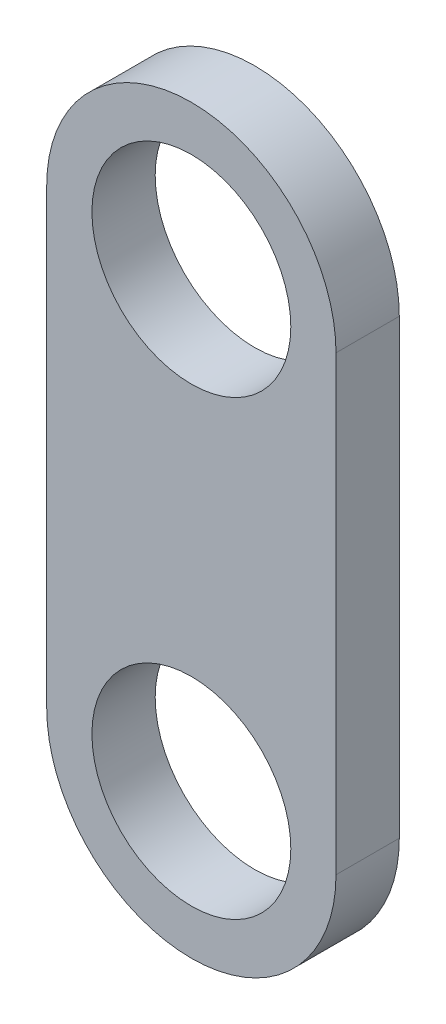
ISO-10303-21;
HEADER;
FILE_DESCRIPTION(('STEP AP214'),'2;1');
FILE_NAME('part.step','',(''),(''),'','','');
FILE_SCHEMA(('AUTOMOTIVE_DESIGN { 1 0 10303 214 1 1 1 1 }'));
ENDSEC;
DATA;
#1=APPLICATION_CONTEXT('core data for automotive mechanical design processes');
#2=APPLICATION_PROTOCOL_DEFINITION('international standard','automotive_design',2000,#1);
#3=PRODUCT_CONTEXT('',#1,'mechanical');
#4=PRODUCT('Part','Part','',(#3));
#5=PRODUCT_RELATED_PRODUCT_CATEGORY('part','',(#4));
#6=PRODUCT_DEFINITION_FORMATION('','',#4);
#7=PRODUCT_DEFINITION_CONTEXT('part definition',#1,'design');
#8=PRODUCT_DEFINITION('design','',#6,#7);
#9=PRODUCT_DEFINITION_SHAPE('','',#8);
#10=(LENGTH_UNIT() NAMED_UNIT(*) SI_UNIT(.MILLI.,.METRE.));
#11=(NAMED_UNIT(*) PLANE_ANGLE_UNIT() SI_UNIT($,.RADIAN.));
#12=(NAMED_UNIT(*) SI_UNIT($,.STERADIAN.) SOLID_ANGLE_UNIT());
#13=UNCERTAINTY_MEASURE_WITH_UNIT(LENGTH_MEASURE(1.E-05),#10,'distance_accuracy_value','');
#14=(GEOMETRIC_REPRESENTATION_CONTEXT(3) GLOBAL_UNCERTAINTY_ASSIGNED_CONTEXT((#13)) GLOBAL_UNIT_ASSIGNED_CONTEXT((#10,
#11,#12)) REPRESENTATION_CONTEXT('',''));
#15=CARTESIAN_POINT('',(0.,0.,0.));
#16=DIRECTION('',(0.,0.,1.));
#17=DIRECTION('',(1.,0.,0.));
#18=AXIS2_PLACEMENT_3D('',#15,#16,#17);
#19=CARTESIAN_POINT('',(0.,-25.,7.));
#20=DIRECTION('',(0.,0.,-1.));
#21=DIRECTION('',(-1.,0.,0.));
#22=AXIS2_PLACEMENT_3D('',#19,#20,#21);
#23=CYLINDRICAL_SURFACE('',#22,16.);
#24=CARTESIAN_POINT('',(0.,-25.,0.));
#25=DIRECTION('',(0.,0.,1.));
#26=DIRECTION('',(1.,0.,0.));
#27=AXIS2_PLACEMENT_3D('',#24,#25,#26);
#28=CIRCLE('',#27,16.);
#29=CARTESIAN_POINT('',(-16.,-25.,0.));
#30=VERTEX_POINT('',#29);
#31=CARTESIAN_POINT('',(16.,-25.,0.));
#32=VERTEX_POINT('',#31);
#33=EDGE_CURVE('E122',#30,#32,#28,.T.);
#34=ORIENTED_EDGE('',*,*,#33,.T.);
#35=DIRECTION('',(0.,0.,-1.));
#36=VECTOR('',#35,1.);
#37=CARTESIAN_POINT('',(16.,-25.,7.));
#38=LINE('',#37,#36);
#39=CARTESIAN_POINT('',(16.,-25.,7.));
#40=VERTEX_POINT('',#39);
#41=EDGE_CURVE('E11',#40,#32,#38,.T.);
#42=ORIENTED_EDGE('',*,*,#41,.F.);
#43=CARTESIAN_POINT('',(0.,-25.,7.));
#44=DIRECTION('',(0.,0.,1.));
#45=DIRECTION('',(1.,0.,0.));
#46=AXIS2_PLACEMENT_3D('',#43,#44,#45);
#47=CIRCLE('',#46,16.);
#48=CARTESIAN_POINT('',(-16.,-25.,7.));
#49=VERTEX_POINT('',#48);
#50=EDGE_CURVE('E98',#49,#40,#47,.T.);
#51=ORIENTED_EDGE('',*,*,#50,.F.);
#52=DIRECTION('',(0.,0.,-1.));
#53=VECTOR('',#52,1.);
#54=CARTESIAN_POINT('',(-16.,-25.,7.));
#55=LINE('',#54,#53);
#56=EDGE_CURVE('E121',#49,#30,#55,.T.);
#57=ORIENTED_EDGE('',*,*,#56,.T.);
#58=EDGE_LOOP('',(#34,#42,#51,#57));
#59=FACE_BOUND('',#58,.T.);
#60=ADVANCED_FACE('F45',(#59),#23,.T.);
#61=CARTESIAN_POINT('',(16.,0.,7.));
#62=DIRECTION('',(-1.,0.,0.));
#63=DIRECTION('',(0.,0.,1.));
#64=AXIS2_PLACEMENT_3D('',#61,#62,#63);
#65=PLANE('',#64);
#66=DIRECTION('',(0.,1.,0.));
#67=VECTOR('',#66,1.);
#68=CARTESIAN_POINT('',(16.,0.,0.));
#69=LINE('',#68,#67);
#70=CARTESIAN_POINT('',(16.,25.,0.));
#71=VERTEX_POINT('',#70);
#72=EDGE_CURVE('E103',#32,#71,#69,.T.);
#73=ORIENTED_EDGE('',*,*,#72,.T.);
#74=DIRECTION('',(0.,0.,-1.));
#75=VECTOR('',#74,1.);
#76=CARTESIAN_POINT('',(16.,25.,7.));
#77=LINE('',#76,#75);
#78=CARTESIAN_POINT('',(16.,25.,7.));
#79=VERTEX_POINT('',#78);
#80=EDGE_CURVE('E54',#79,#71,#77,.T.);
#81=ORIENTED_EDGE('',*,*,#80,.F.);
#82=DIRECTION('',(0.,1.,0.));
#83=VECTOR('',#82,1.);
#84=CARTESIAN_POINT('',(16.,0.,7.));
#85=LINE('',#84,#83);
#86=EDGE_CURVE('E92',#40,#79,#85,.T.);
#87=ORIENTED_EDGE('',*,*,#86,.F.);
#88=ORIENTED_EDGE('',*,*,#41,.T.);
#89=EDGE_LOOP('',(#73,#81,#87,#88));
#90=FACE_BOUND('',#89,.T.);
#91=ADVANCED_FACE('F102',(#90),#65,.F.);
#92=CARTESIAN_POINT('',(0.,25.,7.));
#93=DIRECTION('',(0.,0.,-1.));
#94=DIRECTION('',(-1.,0.,0.));
#95=AXIS2_PLACEMENT_3D('',#92,#93,#94);
#96=CYLINDRICAL_SURFACE('',#95,16.);
#97=CARTESIAN_POINT('',(0.,25.,0.));
#98=DIRECTION('',(0.,0.,1.));
#99=DIRECTION('',(1.,0.,0.));
#100=AXIS2_PLACEMENT_3D('',#97,#98,#99);
#101=CIRCLE('',#100,16.);
#102=CARTESIAN_POINT('',(-16.,25.,0.));
#103=VERTEX_POINT('',#102);
#104=EDGE_CURVE('E79',#71,#103,#101,.T.);
#105=ORIENTED_EDGE('',*,*,#104,.T.);
#106=DIRECTION('',(0.,0.,-1.));
#107=VECTOR('',#106,1.);
#108=CARTESIAN_POINT('',(-16.,25.,7.));
#109=LINE('',#108,#107);
#110=CARTESIAN_POINT('',(-16.,25.,7.));
#111=VERTEX_POINT('',#110);
#112=EDGE_CURVE('E105',#111,#103,#109,.T.);
#113=ORIENTED_EDGE('',*,*,#112,.F.);
#114=CARTESIAN_POINT('',(0.,25.,7.));
#115=DIRECTION('',(0.,0.,1.));
#116=DIRECTION('',(1.,0.,0.));
#117=AXIS2_PLACEMENT_3D('',#114,#115,#116);
#118=CIRCLE('',#117,16.);
#119=EDGE_CURVE('E96',#79,#111,#118,.T.);
#120=ORIENTED_EDGE('',*,*,#119,.F.);
#121=ORIENTED_EDGE('',*,*,#80,.T.);
#122=EDGE_LOOP('',(#105,#113,#120,#121));
#123=FACE_BOUND('',#122,.T.);
#124=ADVANCED_FACE('F106',(#123),#96,.T.);
#125=CARTESIAN_POINT('',(0.,25.,7.));
#126=DIRECTION('',(0.,0.,-1.));
#127=DIRECTION('',(-1.,0.,0.));
#128=AXIS2_PLACEMENT_3D('',#125,#126,#127);
#129=CYLINDRICAL_SURFACE('',#128,11.);
#130=CARTESIAN_POINT('',(0.,25.,7.));
#131=DIRECTION('',(0.,0.,1.));
#132=DIRECTION('',(1.,0.,0.));
#133=AXIS2_PLACEMENT_3D('',#130,#131,#132);
#134=CIRCLE('',#133,11.);
#135=CARTESIAN_POINT('',(11.,25.,7.));
#136=VERTEX_POINT('',#135);
#137=EDGE_CURVE('E110',#136,#136,#134,.T.);
#138=ORIENTED_EDGE('',*,*,#137,.T.);
#139=EDGE_LOOP('',(#138));
#140=FACE_BOUND('',#139,.T.);
#141=CARTESIAN_POINT('',(0.,25.,0.));
#142=DIRECTION('',(0.,0.,1.));
#143=DIRECTION('',(1.,0.,0.));
#144=AXIS2_PLACEMENT_3D('',#141,#142,#143);
#145=CIRCLE('',#144,11.);
#146=CARTESIAN_POINT('',(11.,25.,0.));
#147=VERTEX_POINT('',#146);
#148=EDGE_CURVE('E132',#147,#147,#145,.T.);
#149=ORIENTED_EDGE('',*,*,#148,.F.);
#150=EDGE_LOOP('',(#149));
#151=FACE_BOUND('',#150,.T.);
#152=ADVANCED_FACE('F157',(#140,#151),#129,.F.);
#153=CARTESIAN_POINT('',(-16.,0.,7.));
#154=DIRECTION('',(1.,0.,0.));
#155=DIRECTION('',(0.,0.,-1.));
#156=AXIS2_PLACEMENT_3D('',#153,#154,#155);
#157=PLANE('',#156);
#158=DIRECTION('',(0.,-1.,0.));
#159=VECTOR('',#158,1.);
#160=CARTESIAN_POINT('',(-16.,0.,0.));
#161=LINE('',#160,#159);
#162=EDGE_CURVE('E85',#103,#30,#161,.T.);
#163=ORIENTED_EDGE('',*,*,#162,.T.);
#164=ORIENTED_EDGE('',*,*,#56,.F.);
#165=DIRECTION('',(0.,-1.,0.));
#166=VECTOR('',#165,1.);
#167=CARTESIAN_POINT('',(-16.,0.,7.));
#168=LINE('',#167,#166);
#169=EDGE_CURVE('E62',#111,#49,#168,.T.);
#170=ORIENTED_EDGE('',*,*,#169,.F.);
#171=ORIENTED_EDGE('',*,*,#112,.T.);
#172=EDGE_LOOP('',(#163,#164,#170,#171));
#173=FACE_BOUND('',#172,.T.);
#174=ADVANCED_FACE('F143',(#173),#157,.F.);
#175=CARTESIAN_POINT('',(0.,-25.,7.));
#176=DIRECTION('',(0.,0.,-1.));
#177=DIRECTION('',(-1.,0.,0.));
#178=AXIS2_PLACEMENT_3D('',#175,#176,#177);
#179=CYLINDRICAL_SURFACE('',#178,11.);
#180=CARTESIAN_POINT('',(0.,-25.,7.));
#181=DIRECTION('',(0.,0.,1.));
#182=DIRECTION('',(1.,0.,0.));
#183=AXIS2_PLACEMENT_3D('',#180,#181,#182);
#184=CIRCLE('',#183,11.);
#185=CARTESIAN_POINT('',(11.,-25.,7.));
#186=VERTEX_POINT('',#185);
#187=EDGE_CURVE('E117',#186,#186,#184,.T.);
#188=ORIENTED_EDGE('',*,*,#187,.T.);
#189=EDGE_LOOP('',(#188));
#190=FACE_BOUND('',#189,.T.);
#191=CARTESIAN_POINT('',(0.,-25.,0.));
#192=DIRECTION('',(0.,0.,1.));
#193=DIRECTION('',(1.,0.,0.));
#194=AXIS2_PLACEMENT_3D('',#191,#192,#193);
#195=CIRCLE('',#194,11.);
#196=CARTESIAN_POINT('',(11.,-25.,0.));
#197=VERTEX_POINT('',#196);
#198=EDGE_CURVE('E136',#197,#197,#195,.T.);
#199=ORIENTED_EDGE('',*,*,#198,.F.);
#200=EDGE_LOOP('',(#199));
#201=FACE_BOUND('',#200,.T.);
#202=ADVANCED_FACE('F162',(#190,#201),#179,.F.);
#203=CARTESIAN_POINT('',(0.,0.,7.));
#204=DIRECTION('',(0.,0.,1.));
#205=DIRECTION('',(1.,0.,0.));
#206=AXIS2_PLACEMENT_3D('',#203,#204,#205);
#207=PLANE('',#206);
#208=ORIENTED_EDGE('',*,*,#50,.T.);
#209=ORIENTED_EDGE('',*,*,#86,.T.);
#210=ORIENTED_EDGE('',*,*,#119,.T.);
#211=ORIENTED_EDGE('',*,*,#169,.T.);
#212=EDGE_LOOP('',(#208,#209,#210,#211));
#213=FACE_BOUND('',#212,.T.);
#214=ORIENTED_EDGE('',*,*,#137,.F.);
#215=EDGE_LOOP('',(#214));
#216=FACE_BOUND('',#215,.T.);
#217=ORIENTED_EDGE('',*,*,#187,.F.);
#218=EDGE_LOOP('',(#217));
#219=FACE_BOUND('',#218,.T.);
#220=ADVANCED_FACE('F93',(#213,#216,#219),#207,.T.);
#221=CARTESIAN_POINT('',(0.,0.,0.));
#222=DIRECTION('',(0.,0.,1.));
#223=DIRECTION('',(1.,0.,0.));
#224=AXIS2_PLACEMENT_3D('',#221,#222,#223);
#225=PLANE('',#224);
#226=ORIENTED_EDGE('',*,*,#33,.F.);
#227=ORIENTED_EDGE('',*,*,#162,.F.);
#228=ORIENTED_EDGE('',*,*,#104,.F.);
#229=ORIENTED_EDGE('',*,*,#72,.F.);
#230=EDGE_LOOP('',(#226,#227,#228,#229));
#231=FACE_BOUND('',#230,.T.);
#232=ORIENTED_EDGE('',*,*,#148,.T.);
#233=EDGE_LOOP('',(#232));
#234=FACE_BOUND('',#233,.T.);
#235=ORIENTED_EDGE('',*,*,#198,.T.);
#236=EDGE_LOOP('',(#235));
#237=FACE_BOUND('',#236,.T.);
#238=ADVANCED_FACE('F146',(#231,#234,#237),#225,.F.);
#239=CLOSED_SHELL('',(#60,#91,#124,#152,#174,#202,#220,#238));
#240=MANIFOLD_SOLID_BREP('B2',#239);
#241=ADVANCED_BREP_SHAPE_REPRESENTATION('',(#18,#240),#14);
#242=SHAPE_DEFINITION_REPRESENTATION(#9,#241);
ENDSEC;
END-ISO-10303-21;
